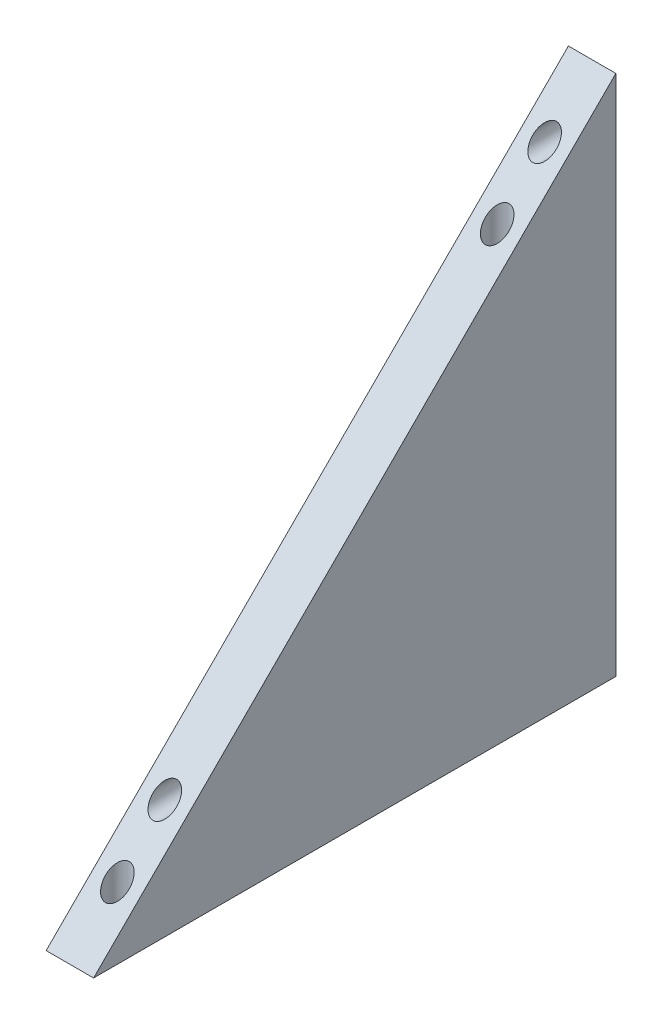
ISO-10303-21;
HEADER;
FILE_DESCRIPTION(('STEP AP214'),'2;1');
FILE_NAME('part.step','',(''),(''),'','','');
FILE_SCHEMA(('AUTOMOTIVE_DESIGN { 1 0 10303 214 1 1 1 1 }'));
ENDSEC;
DATA;
#1=APPLICATION_CONTEXT('core data for automotive mechanical design processes');
#2=APPLICATION_PROTOCOL_DEFINITION('international standard','automotive_design',2000,#1);
#3=PRODUCT_CONTEXT('',#1,'mechanical');
#4=PRODUCT('Part','Part','',(#3));
#5=PRODUCT_RELATED_PRODUCT_CATEGORY('part','',(#4));
#6=PRODUCT_DEFINITION_FORMATION('','',#4);
#7=PRODUCT_DEFINITION_CONTEXT('part definition',#1,'design');
#8=PRODUCT_DEFINITION('design','',#6,#7);
#9=PRODUCT_DEFINITION_SHAPE('','',#8);
#10=(LENGTH_UNIT() NAMED_UNIT(*) SI_UNIT(.MILLI.,.METRE.));
#11=(NAMED_UNIT(*) PLANE_ANGLE_UNIT() SI_UNIT($,.RADIAN.));
#12=(NAMED_UNIT(*) SI_UNIT($,.STERADIAN.) SOLID_ANGLE_UNIT());
#13=UNCERTAINTY_MEASURE_WITH_UNIT(LENGTH_MEASURE(1.E-05),#10,'distance_accuracy_value','');
#14=(GEOMETRIC_REPRESENTATION_CONTEXT(3) GLOBAL_UNCERTAINTY_ASSIGNED_CONTEXT((#13)) GLOBAL_UNIT_ASSIGNED_CONTEXT((#10,
#11,#12)) REPRESENTATION_CONTEXT('',''));
#15=CARTESIAN_POINT('',(0.,0.,0.));
#16=DIRECTION('',(0.,0.,1.));
#17=DIRECTION('',(1.,0.,0.));
#18=AXIS2_PLACEMENT_3D('',#15,#16,#17);
#19=CARTESIAN_POINT('',(8.,88.,0.));
#20=DIRECTION('',(0.,-0.707106781186547,-0.707106781186547));
#21=DIRECTION('',(0.,0.707106781186548,-0.707106781186548));
#22=AXIS2_PLACEMENT_3D('',#19,#20,#21);
#23=PLANE('',#22);
#24=CARTESIAN_POINT('',(4.,16.,72.));
#25=DIRECTION('',(0.,-0.707106781186547,-0.707106781186547));
#26=DIRECTION('',(0.,0.707106781186548,-0.707106781186548));
#27=AXIS2_PLACEMENT_3D('',#24,#25,#26);
#28=ELLIPSE('',#27,2.82842712474619,2.);
#29=CARTESIAN_POINT('',(4.,18.,70.));
#30=VERTEX_POINT('',#29);
#31=EDGE_CURVE('E122',#30,#30,#28,.F.);
#32=ORIENTED_EDGE('',*,*,#31,.F.);
#33=EDGE_LOOP('',(#32));
#34=FACE_BOUND('',#33,.T.);
#35=CARTESIAN_POINT('',(4.,72.,16.));
#36=DIRECTION('',(0.,-0.707106781186547,-0.707106781186547));
#37=DIRECTION('',(0.,-0.707106781186548,0.707106781186548));
#38=AXIS2_PLACEMENT_3D('',#35,#36,#37);
#39=ELLIPSE('',#38,2.82842712474619,2.);
#40=CARTESIAN_POINT('',(4.,70.,18.));
#41=VERTEX_POINT('',#40);
#42=EDGE_CURVE('E107',#41,#41,#39,.F.);
#43=ORIENTED_EDGE('',*,*,#42,.F.);
#44=EDGE_LOOP('',(#43));
#45=FACE_BOUND('',#44,.T.);
#46=DIRECTION('',(0.,-0.707106781186548,0.707106781186548));
#47=VECTOR('',#46,1.);
#48=CARTESIAN_POINT('',(0.,88.,0.));
#49=LINE('',#48,#47);
#50=CARTESIAN_POINT('',(0.,88.,0.));
#51=VERTEX_POINT('',#50);
#52=CARTESIAN_POINT('',(0.,0.,88.));
#53=VERTEX_POINT('',#52);
#54=EDGE_CURVE('E104',#51,#53,#49,.T.);
#55=ORIENTED_EDGE('',*,*,#54,.T.);
#56=DIRECTION('',(-1.,0.,0.));
#57=VECTOR('',#56,1.);
#58=CARTESIAN_POINT('',(8.,0.,88.));
#59=LINE('',#58,#57);
#60=CARTESIAN_POINT('',(8.,0.,88.));
#61=VERTEX_POINT('',#60);
#62=EDGE_CURVE('E90',#61,#53,#59,.T.);
#63=ORIENTED_EDGE('',*,*,#62,.F.);
#64=DIRECTION('',(0.,-0.707106781186548,0.707106781186548));
#65=VECTOR('',#64,1.);
#66=CARTESIAN_POINT('',(8.,88.,0.));
#67=LINE('',#66,#65);
#68=CARTESIAN_POINT('',(8.,88.,0.));
#69=VERTEX_POINT('',#68);
#70=EDGE_CURVE('E101',#69,#61,#67,.T.);
#71=ORIENTED_EDGE('',*,*,#70,.F.);
#72=DIRECTION('',(-1.,0.,0.));
#73=VECTOR('',#72,1.);
#74=CARTESIAN_POINT('',(8.,88.,0.));
#75=LINE('',#74,#73);
#76=EDGE_CURVE('E98',#69,#51,#75,.T.);
#77=ORIENTED_EDGE('',*,*,#76,.T.);
#78=EDGE_LOOP('',(#55,#63,#71,#77));
#79=FACE_BOUND('',#78,.T.);
#80=CARTESIAN_POINT('',(4.,7.99999999999999,80.));
#81=DIRECTION('',(0.,-0.707106781186547,-0.707106781186547));
#82=DIRECTION('',(0.,-0.707106781186548,0.707106781186548));
#83=AXIS2_PLACEMENT_3D('',#80,#81,#82);
#84=ELLIPSE('',#83,2.82842712474619,2.);
#85=CARTESIAN_POINT('',(4.,5.99999999999999,82.));
#86=VERTEX_POINT('',#85);
#87=EDGE_CURVE('E116',#86,#86,#84,.F.);
#88=ORIENTED_EDGE('',*,*,#87,.F.);
#89=EDGE_LOOP('',(#88));
#90=FACE_BOUND('',#89,.T.);
#91=CARTESIAN_POINT('',(4.,80.,7.99999999999999));
#92=DIRECTION('',(0.,-0.707106781186547,-0.707106781186547));
#93=DIRECTION('',(0.,0.707106781186548,-0.707106781186548));
#94=AXIS2_PLACEMENT_3D('',#91,#92,#93);
#95=ELLIPSE('',#94,2.82842712474619,2.);
#96=CARTESIAN_POINT('',(4.,82.,5.99999999999999));
#97=VERTEX_POINT('',#96);
#98=EDGE_CURVE('E128',#97,#97,#95,.F.);
#99=ORIENTED_EDGE('',*,*,#98,.F.);
#100=EDGE_LOOP('',(#99));
#101=FACE_BOUND('',#100,.T.);
#102=ADVANCED_FACE('F32',(#34,#45,#79,#90,#101),#23,.F.);
#103=CARTESIAN_POINT('',(8.,0.,0.));
#104=DIRECTION('',(0.,0.,1.));
#105=DIRECTION('',(1.,0.,0.));
#106=AXIS2_PLACEMENT_3D('',#103,#104,#105);
#107=PLANE('',#106);
#108=CARTESIAN_POINT('',(4.,16.,0.));
#109=DIRECTION('',(0.,0.,1.));
#110=DIRECTION('',(1.,0.,0.));
#111=AXIS2_PLACEMENT_3D('',#108,#109,#110);
#112=CIRCLE('',#111,2.);
#113=CARTESIAN_POINT('',(6.,16.,0.));
#114=VERTEX_POINT('',#113);
#115=EDGE_CURVE('E125',#114,#114,#112,.T.);
#116=ORIENTED_EDGE('',*,*,#115,.T.);
#117=EDGE_LOOP('',(#116));
#118=FACE_BOUND('',#117,.T.);
#119=DIRECTION('',(0.,1.,0.));
#120=VECTOR('',#119,1.);
#121=CARTESIAN_POINT('',(0.,0.,0.));
#122=LINE('',#121,#120);
#123=CARTESIAN_POINT('',(0.,0.,0.));
#124=VERTEX_POINT('',#123);
#125=EDGE_CURVE('E70',#124,#51,#122,.T.);
#126=ORIENTED_EDGE('',*,*,#125,.T.);
#127=ORIENTED_EDGE('',*,*,#76,.F.);
#128=DIRECTION('',(0.,1.,0.));
#129=VECTOR('',#128,1.);
#130=CARTESIAN_POINT('',(8.,0.,0.));
#131=LINE('',#130,#129);
#132=CARTESIAN_POINT('',(8.,0.,0.));
#133=VERTEX_POINT('',#132);
#134=EDGE_CURVE('E53',#133,#69,#131,.T.);
#135=ORIENTED_EDGE('',*,*,#134,.F.);
#136=DIRECTION('',(-1.,0.,0.));
#137=VECTOR('',#136,1.);
#138=CARTESIAN_POINT('',(8.,0.,0.));
#139=LINE('',#138,#137);
#140=EDGE_CURVE('E96',#133,#124,#139,.T.);
#141=ORIENTED_EDGE('',*,*,#140,.T.);
#142=EDGE_LOOP('',(#126,#127,#135,#141));
#143=FACE_BOUND('',#142,.T.);
#144=CARTESIAN_POINT('',(4.,80.,0.));
#145=DIRECTION('',(0.,0.,1.));
#146=DIRECTION('',(1.,0.,0.));
#147=AXIS2_PLACEMENT_3D('',#144,#145,#146);
#148=CIRCLE('',#147,2.);
#149=CARTESIAN_POINT('',(6.,80.,0.));
#150=VERTEX_POINT('',#149);
#151=EDGE_CURVE('E131',#150,#150,#148,.T.);
#152=ORIENTED_EDGE('',*,*,#151,.T.);
#153=EDGE_LOOP('',(#152));
#154=FACE_BOUND('',#153,.T.);
#155=ADVANCED_FACE('F135',(#118,#143,#154),#107,.F.);
#156=CARTESIAN_POINT('',(4.,88.,16.));
#157=DIRECTION('',(0.,-1.,0.));
#158=DIRECTION('',(0.,0.,-1.));
#159=AXIS2_PLACEMENT_3D('',#156,#157,#158);
#160=CYLINDRICAL_SURFACE('',#159,2.);
#161=CARTESIAN_POINT('',(4.,0.,16.));
#162=DIRECTION('',(0.,1.,0.));
#163=DIRECTION('',(0.,0.,1.));
#164=AXIS2_PLACEMENT_3D('',#161,#162,#163);
#165=CIRCLE('',#164,2.);
#166=CARTESIAN_POINT('',(4.,0.,18.));
#167=VERTEX_POINT('',#166);
#168=EDGE_CURVE('E113',#167,#167,#165,.T.);
#169=ORIENTED_EDGE('',*,*,#168,.F.);
#170=EDGE_LOOP('',(#169));
#171=FACE_BOUND('',#170,.T.);
#172=CARTESIAN_POINT('',(4.,16.,16.));
#173=DIRECTION('',(0.,-0.707106781186547,0.707106781186547));
#174=DIRECTION('',(0.,-0.707106781186547,-0.707106781186547));
#175=AXIS2_PLACEMENT_3D('',#172,#173,#174);
#176=ELLIPSE('',#175,2.82842712474619,2.);
#177=CARTESIAN_POINT('',(6.,16.,16.));
#178=VERTEX_POINT('',#177);
#179=CARTESIAN_POINT('',(2.,16.,16.));
#180=VERTEX_POINT('',#179);
#181=EDGE_CURVE('E44',#178,#180,#176,.F.);
#182=ORIENTED_EDGE('',*,*,#181,.T.);
#183=CARTESIAN_POINT('',(4.,16.,16.));
#184=DIRECTION('',(0.,-0.707106781186547,-0.707106781186547));
#185=DIRECTION('',(0.,-0.707106781186547,0.707106781186547));
#186=AXIS2_PLACEMENT_3D('',#183,#184,#185);
#187=ELLIPSE('',#186,2.82842712474619,2.);
#188=EDGE_CURVE('E11',#180,#178,#187,.F.);
#189=ORIENTED_EDGE('',*,*,#188,.T.);
#190=EDGE_LOOP('',(#182,#189));
#191=FACE_BOUND('',#190,.T.);
#192=ADVANCED_FACE('F92',(#171,#191),#160,.F.);
#193=ORIENTED_EDGE('',*,*,#42,.T.);
#194=EDGE_LOOP('',(#193));
#195=FACE_BOUND('',#194,.T.);
#196=CARTESIAN_POINT('',(4.,16.,16.));
#197=DIRECTION('',(0.,-0.707106781186547,0.707106781186547));
#198=DIRECTION('',(0.,-0.707106781186547,-0.707106781186547));
#199=AXIS2_PLACEMENT_3D('',#196,#197,#198);
#200=ELLIPSE('',#199,2.82842712474619,2.);
#201=EDGE_CURVE('E82',#178,#180,#200,.T.);
#202=ORIENTED_EDGE('',*,*,#201,.T.);
#203=CARTESIAN_POINT('',(4.,16.,16.));
#204=DIRECTION('',(0.,-0.707106781186547,-0.707106781186547));
#205=DIRECTION('',(0.,-0.707106781186547,0.707106781186547));
#206=AXIS2_PLACEMENT_3D('',#203,#204,#205);
#207=ELLIPSE('',#206,2.82842712474619,2.);
#208=EDGE_CURVE('E39',#180,#178,#207,.T.);
#209=ORIENTED_EDGE('',*,*,#208,.T.);
#210=EDGE_LOOP('',(#202,#209));
#211=FACE_BOUND('',#210,.T.);
#212=ADVANCED_FACE('F93',(#195,#211),#160,.F.);
#213=CARTESIAN_POINT('',(8.,0.,88.));
#214=DIRECTION('',(0.,1.,0.));
#215=DIRECTION('',(0.,0.,1.));
#216=AXIS2_PLACEMENT_3D('',#213,#214,#215);
#217=PLANE('',#216);
#218=ORIENTED_EDGE('',*,*,#168,.T.);
#219=EDGE_LOOP('',(#218));
#220=FACE_BOUND('',#219,.T.);
#221=DIRECTION('',(0.,0.,-1.));
#222=VECTOR('',#221,1.);
#223=CARTESIAN_POINT('',(0.,0.,88.));
#224=LINE('',#223,#222);
#225=EDGE_CURVE('E102',#53,#124,#224,.T.);
#226=ORIENTED_EDGE('',*,*,#225,.T.);
#227=ORIENTED_EDGE('',*,*,#140,.F.);
#228=DIRECTION('',(0.,0.,-1.));
#229=VECTOR('',#228,1.);
#230=CARTESIAN_POINT('',(8.,0.,88.));
#231=LINE('',#230,#229);
#232=EDGE_CURVE('E76',#61,#133,#231,.T.);
#233=ORIENTED_EDGE('',*,*,#232,.F.);
#234=ORIENTED_EDGE('',*,*,#62,.T.);
#235=EDGE_LOOP('',(#226,#227,#233,#234));
#236=FACE_BOUND('',#235,.T.);
#237=CARTESIAN_POINT('',(4.,0.,80.));
#238=DIRECTION('',(0.,1.,0.));
#239=DIRECTION('',(0.,0.,1.));
#240=AXIS2_PLACEMENT_3D('',#237,#238,#239);
#241=CIRCLE('',#240,2.);
#242=CARTESIAN_POINT('',(4.,0.,82.));
#243=VERTEX_POINT('',#242);
#244=EDGE_CURVE('E119',#243,#243,#241,.T.);
#245=ORIENTED_EDGE('',*,*,#244,.T.);
#246=EDGE_LOOP('',(#245));
#247=FACE_BOUND('',#246,.T.);
#248=ADVANCED_FACE('F179',(#220,#236,#247),#217,.F.);
#249=CARTESIAN_POINT('',(8.,0.,0.));
#250=DIRECTION('',(1.,0.,0.));
#251=DIRECTION('',(0.,0.,-1.));
#252=AXIS2_PLACEMENT_3D('',#249,#250,#251);
#253=PLANE('',#252);
#254=ORIENTED_EDGE('',*,*,#70,.T.);
#255=ORIENTED_EDGE('',*,*,#232,.T.);
#256=ORIENTED_EDGE('',*,*,#134,.T.);
#257=EDGE_LOOP('',(#254,#255,#256));
#258=FACE_BOUND('',#257,.T.);
#259=ADVANCED_FACE('F170',(#258),#253,.T.);
#260=CARTESIAN_POINT('',(0.,0.,0.));
#261=DIRECTION('',(1.,0.,0.));
#262=DIRECTION('',(0.,0.,-1.));
#263=AXIS2_PLACEMENT_3D('',#260,#261,#262);
#264=PLANE('',#263);
#265=ORIENTED_EDGE('',*,*,#54,.F.);
#266=ORIENTED_EDGE('',*,*,#125,.F.);
#267=ORIENTED_EDGE('',*,*,#225,.F.);
#268=EDGE_LOOP('',(#265,#266,#267));
#269=FACE_BOUND('',#268,.T.);
#270=ADVANCED_FACE('F161',(#269),#264,.F.);
#271=CARTESIAN_POINT('',(4.,88.,80.));
#272=DIRECTION('',(0.,-1.,0.));
#273=DIRECTION('',(0.,0.,-1.));
#274=AXIS2_PLACEMENT_3D('',#271,#272,#273);
#275=CYLINDRICAL_SURFACE('',#274,2.);
#276=ORIENTED_EDGE('',*,*,#244,.F.);
#277=EDGE_LOOP('',(#276));
#278=FACE_BOUND('',#277,.T.);
#279=ORIENTED_EDGE('',*,*,#87,.T.);
#280=EDGE_LOOP('',(#279));
#281=FACE_BOUND('',#280,.T.);
#282=ADVANCED_FACE('F159',(#278,#281),#275,.F.);
#283=CARTESIAN_POINT('',(4.,16.,88.));
#284=DIRECTION('',(0.,0.,-1.));
#285=DIRECTION('',(-1.,0.,0.));
#286=AXIS2_PLACEMENT_3D('',#283,#284,#285);
#287=CYLINDRICAL_SURFACE('',#286,2.);
#288=ORIENTED_EDGE('',*,*,#115,.F.);
#289=EDGE_LOOP('',(#288));
#290=FACE_BOUND('',#289,.T.);
#291=ORIENTED_EDGE('',*,*,#181,.F.);
#292=ORIENTED_EDGE('',*,*,#208,.F.);
#293=EDGE_LOOP('',(#291,#292));
#294=FACE_BOUND('',#293,.T.);
#295=ADVANCED_FACE('F89',(#290,#294),#287,.F.);
#296=ORIENTED_EDGE('',*,*,#201,.F.);
#297=ORIENTED_EDGE('',*,*,#188,.F.);
#298=EDGE_LOOP('',(#296,#297));
#299=FACE_BOUND('',#298,.T.);
#300=ORIENTED_EDGE('',*,*,#31,.T.);
#301=EDGE_LOOP('',(#300));
#302=FACE_BOUND('',#301,.T.);
#303=ADVANCED_FACE('F83',(#299,#302),#287,.F.);
#304=CARTESIAN_POINT('',(4.,80.,88.));
#305=DIRECTION('',(0.,0.,-1.));
#306=DIRECTION('',(-1.,0.,0.));
#307=AXIS2_PLACEMENT_3D('',#304,#305,#306);
#308=CYLINDRICAL_SURFACE('',#307,2.);
#309=ORIENTED_EDGE('',*,*,#151,.F.);
#310=EDGE_LOOP('',(#309));
#311=FACE_BOUND('',#310,.T.);
#312=ORIENTED_EDGE('',*,*,#98,.T.);
#313=EDGE_LOOP('',(#312));
#314=FACE_BOUND('',#313,.T.);
#315=ADVANCED_FACE('F137',(#311,#314),#308,.F.);
#316=CLOSED_SHELL('',(#102,#155,#192,#212,#248,#259,#270,#282,#295,#303,#315));
#317=MANIFOLD_SOLID_BREP('B2',#316);
#318=ADVANCED_BREP_SHAPE_REPRESENTATION('',(#18,#317),#14);
#319=SHAPE_DEFINITION_REPRESENTATION(#9,#318);
ENDSEC;
END-ISO-10303-21;
